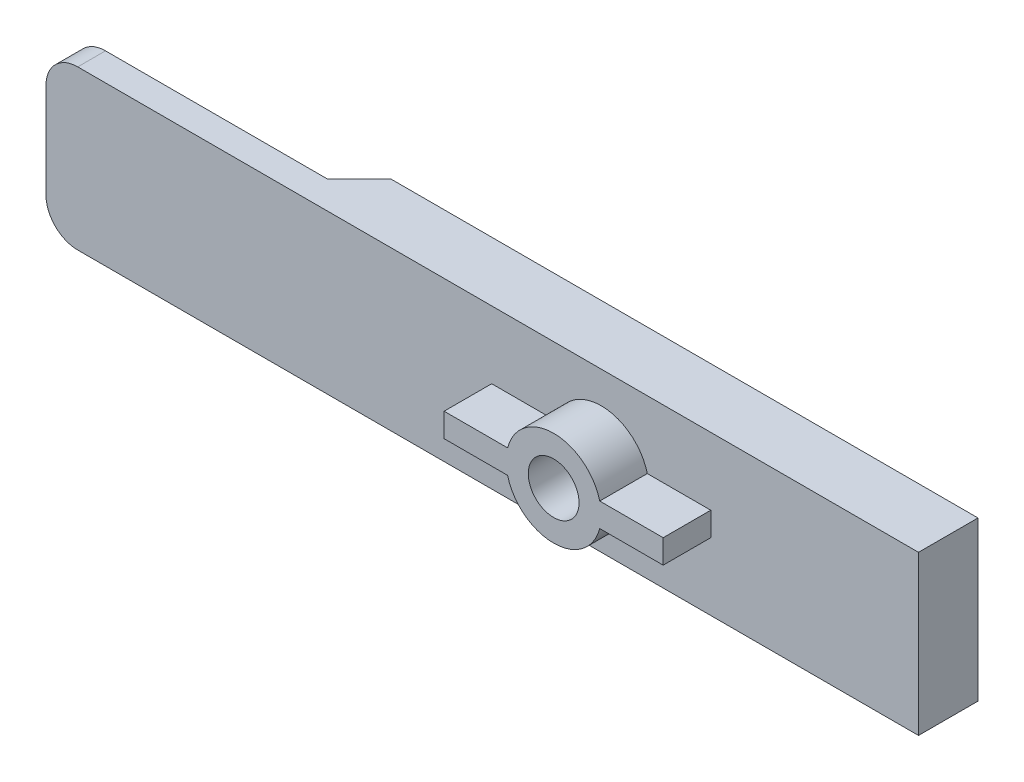
ISO-10303-21;
HEADER;
FILE_DESCRIPTION(('STEP AP214'),'2;1');
FILE_NAME('part.step','',(''),(''),'','','');
FILE_SCHEMA(('AUTOMOTIVE_DESIGN { 1 0 10303 214 1 1 1 1 }'));
ENDSEC;
DATA;
#1=APPLICATION_CONTEXT('core data for automotive mechanical design processes');
#2=APPLICATION_PROTOCOL_DEFINITION('international standard','automotive_design',2000,#1);
#3=PRODUCT_CONTEXT('',#1,'mechanical');
#4=PRODUCT('Part','Part','',(#3));
#5=PRODUCT_RELATED_PRODUCT_CATEGORY('part','',(#4));
#6=PRODUCT_DEFINITION_FORMATION('','',#4);
#7=PRODUCT_DEFINITION_CONTEXT('part definition',#1,'design');
#8=PRODUCT_DEFINITION('design','',#6,#7);
#9=PRODUCT_DEFINITION_SHAPE('','',#8);
#10=(LENGTH_UNIT() NAMED_UNIT(*) SI_UNIT(.MILLI.,.METRE.));
#11=(NAMED_UNIT(*) PLANE_ANGLE_UNIT() SI_UNIT($,.RADIAN.));
#12=(NAMED_UNIT(*) SI_UNIT($,.STERADIAN.) SOLID_ANGLE_UNIT());
#13=UNCERTAINTY_MEASURE_WITH_UNIT(LENGTH_MEASURE(1.E-05),#10,'distance_accuracy_value','');
#14=(GEOMETRIC_REPRESENTATION_CONTEXT(3) GLOBAL_UNCERTAINTY_ASSIGNED_CONTEXT((#13)) GLOBAL_UNIT_ASSIGNED_CONTEXT((#10,
#11,#12)) REPRESENTATION_CONTEXT('',''));
#15=CARTESIAN_POINT('',(0.,0.,0.));
#16=DIRECTION('',(0.,0.,1.));
#17=DIRECTION('',(1.,0.,0.));
#18=AXIS2_PLACEMENT_3D('',#15,#16,#17);
#19=CARTESIAN_POINT('',(-10.,0.,0.));
#20=DIRECTION('',(0.,0.,1.));
#21=DIRECTION('',(1.,0.,0.));
#22=AXIS2_PLACEMENT_3D('',#19,#20,#21);
#23=PLANE('',#22);
#24=DIRECTION('',(1.,0.,0.));
#25=VECTOR('',#24,1.);
#26=CARTESIAN_POINT('',(-15.,6.,0.));
#27=LINE('',#26,#25);
#28=CARTESIAN_POINT('',(-15.,6.,0.));
#29=VERTEX_POINT('',#28);
#30=CARTESIAN_POINT('',(1.00000000000003,6.,0.));
#31=VERTEX_POINT('',#30);
#32=EDGE_CURVE('E259',#29,#31,#27,.T.);
#33=ORIENTED_EDGE('',*,*,#32,.F.);
#34=DIRECTION('',(0.,-1.,0.));
#35=VECTOR('',#34,1.);
#36=CARTESIAN_POINT('',(-15.,10.,0.));
#37=LINE('',#36,#35);
#38=CARTESIAN_POINT('',(-15.,8.,0.));
#39=VERTEX_POINT('',#38);
#40=EDGE_CURVE('E256',#39,#29,#37,.T.);
#41=ORIENTED_EDGE('',*,*,#40,.F.);
#42=CARTESIAN_POINT('',(-13.,8.,0.));
#43=DIRECTION('',(0.,0.,1.));
#44=DIRECTION('',(1.,0.,0.));
#45=AXIS2_PLACEMENT_3D('',#42,#43,#44);
#46=CIRCLE('',#45,2.);
#47=CARTESIAN_POINT('',(-13.,10.,0.));
#48=VERTEX_POINT('',#47);
#49=EDGE_CURVE('E66',#39,#48,#46,.F.);
#50=ORIENTED_EDGE('',*,*,#49,.T.);
#51=DIRECTION('',(1.,0.,0.));
#52=VECTOR('',#51,1.);
#53=CARTESIAN_POINT('',(-9.99999999999999,10.,0.));
#54=LINE('',#53,#52);
#55=CARTESIAN_POINT('',(1.00000000000004,10.,0.));
#56=VERTEX_POINT('',#55);
#57=EDGE_CURVE('E239',#48,#56,#54,.T.);
#58=ORIENTED_EDGE('',*,*,#57,.T.);
#59=DIRECTION('',(0.,-1.,0.));
#60=VECTOR('',#59,1.);
#61=CARTESIAN_POINT('',(1.00000000000003,0.,0.));
#62=LINE('',#61,#60);
#63=EDGE_CURVE('E213',#56,#31,#62,.T.);
#64=ORIENTED_EDGE('',*,*,#63,.T.);
#65=EDGE_LOOP('',(#33,#41,#50,#58,#64));
#66=FACE_BOUND('',#65,.T.);
#67=ADVANCED_FACE('F43',(#66),#23,.F.);
#68=DIRECTION('',(-1.,0.,0.));
#69=VECTOR('',#68,1.);
#70=CARTESIAN_POINT('',(-15.,4.,0.));
#71=LINE('',#70,#69);
#72=CARTESIAN_POINT('',(1.00000000000003,4.,0.));
#73=VERTEX_POINT('',#72);
#74=CARTESIAN_POINT('',(-15.,4.,0.));
#75=VERTEX_POINT('',#74);
#76=EDGE_CURVE('E187',#73,#75,#71,.T.);
#77=ORIENTED_EDGE('',*,*,#76,.F.);
#78=CARTESIAN_POINT('',(1.00000000000003,0.,0.));
#79=VERTEX_POINT('',#78);
#80=EDGE_CURVE('E195',#73,#79,#62,.T.);
#81=ORIENTED_EDGE('',*,*,#80,.T.);
#82=DIRECTION('',(1.,0.,0.));
#83=VECTOR('',#82,1.);
#84=CARTESIAN_POINT('',(-10.,0.,0.));
#85=LINE('',#84,#83);
#86=CARTESIAN_POINT('',(-13.,0.,0.));
#87=VERTEX_POINT('',#86);
#88=EDGE_CURVE('E319',#87,#79,#85,.T.);
#89=ORIENTED_EDGE('',*,*,#88,.F.);
#90=CARTESIAN_POINT('',(-13.,2.,0.));
#91=DIRECTION('',(0.,0.,1.));
#92=DIRECTION('',(1.,0.,0.));
#93=AXIS2_PLACEMENT_3D('',#90,#91,#92);
#94=CIRCLE('',#93,2.);
#95=CARTESIAN_POINT('',(-15.,2.,0.));
#96=VERTEX_POINT('',#95);
#97=EDGE_CURVE('E229',#87,#96,#94,.F.);
#98=ORIENTED_EDGE('',*,*,#97,.T.);
#99=EDGE_CURVE('E260',#75,#96,#37,.T.);
#100=ORIENTED_EDGE('',*,*,#99,.F.);
#101=EDGE_LOOP('',(#77,#81,#89,#98,#100));
#102=FACE_BOUND('',#101,.T.);
#103=ADVANCED_FACE('F392',(#102),#23,.F.);
#104=CARTESIAN_POINT('',(3.00000000000005,0.,-2.));
#105=DIRECTION('',(-0.707106781186544,0.,-0.707106781186551));
#106=DIRECTION('',(0.,-1.,0.));
#107=AXIS2_PLACEMENT_3D('',#104,#105,#106);
#108=PLANE('',#107);
#109=DIRECTION('',(0.,1.,0.));
#110=VECTOR('',#109,1.);
#111=CARTESIAN_POINT('',(3.00000000000006,10.,-2.));
#112=LINE('',#111,#110);
#113=CARTESIAN_POINT('',(3.00000000000005,6.,-2.));
#114=VERTEX_POINT('',#113);
#115=CARTESIAN_POINT('',(3.00000000000006,10.,-2.));
#116=VERTEX_POINT('',#115);
#117=EDGE_CURVE('E203',#114,#116,#112,.T.);
#118=ORIENTED_EDGE('',*,*,#117,.F.);
#119=DIRECTION('',(-0.707106781186551,0.,0.707106781186544));
#120=VECTOR('',#119,1.);
#121=CARTESIAN_POINT('',(3.00000000000005,6.,-2.));
#122=LINE('',#121,#120);
#123=EDGE_CURVE('E12',#114,#31,#122,.T.);
#124=ORIENTED_EDGE('',*,*,#123,.T.);
#125=ORIENTED_EDGE('',*,*,#63,.F.);
#126=DIRECTION('',(-0.707106781186551,0.,0.707106781186544));
#127=VECTOR('',#126,1.);
#128=CARTESIAN_POINT('',(3.00000000000006,10.,-2.));
#129=LINE('',#128,#127);
#130=EDGE_CURVE('E202',#116,#56,#129,.T.);
#131=ORIENTED_EDGE('',*,*,#130,.F.);
#132=EDGE_LOOP('',(#118,#124,#125,#131));
#133=FACE_BOUND('',#132,.T.);
#134=ADVANCED_FACE('F397',(#133),#108,.T.);
#135=ORIENTED_EDGE('',*,*,#80,.F.);
#136=DIRECTION('',(0.707106781186551,0.,-0.707106781186544));
#137=VECTOR('',#136,1.);
#138=CARTESIAN_POINT('',(3.00000000000005,4.,-2.));
#139=LINE('',#138,#137);
#140=CARTESIAN_POINT('',(3.00000000000005,4.,-2.));
#141=VERTEX_POINT('',#140);
#142=EDGE_CURVE('E51',#73,#141,#139,.T.);
#143=ORIENTED_EDGE('',*,*,#142,.T.);
#144=CARTESIAN_POINT('',(3.00000000000005,0.,-2.));
#145=VERTEX_POINT('',#144);
#146=EDGE_CURVE('E194',#145,#141,#112,.T.);
#147=ORIENTED_EDGE('',*,*,#146,.F.);
#148=DIRECTION('',(0.707106781186551,0.,-0.707106781186544));
#149=VECTOR('',#148,1.);
#150=CARTESIAN_POINT('',(3.00000000000005,0.,-2.));
#151=LINE('',#150,#149);
#152=EDGE_CURVE('E206',#79,#145,#151,.T.);
#153=ORIENTED_EDGE('',*,*,#152,.F.);
#154=EDGE_LOOP('',(#135,#143,#147,#153));
#155=FACE_BOUND('',#154,.T.);
#156=ADVANCED_FACE('F192',(#155),#108,.T.);
#157=CARTESIAN_POINT('',(0.,0.,1.75));
#158=DIRECTION('',(0.,0.,-1.));
#159=DIRECTION('',(-1.,0.,0.));
#160=AXIS2_PLACEMENT_3D('',#157,#158,#159);
#161=PLANE('',#160);
#162=DIRECTION('',(0.,1.,0.));
#163=VECTOR('',#162,1.);
#164=CARTESIAN_POINT('',(-15.,0.,1.75));
#165=LINE('',#164,#163);
#166=CARTESIAN_POINT('',(-15.,2.,1.75));
#167=VERTEX_POINT('',#166);
#168=CARTESIAN_POINT('',(-15.,8.,1.75));
#169=VERTEX_POINT('',#168);
#170=EDGE_CURVE('E257',#167,#169,#165,.T.);
#171=ORIENTED_EDGE('',*,*,#170,.F.);
#172=CARTESIAN_POINT('',(-13.,2.,1.75));
#173=DIRECTION('',(0.,0.,-1.));
#174=DIRECTION('',(-1.,0.,0.));
#175=AXIS2_PLACEMENT_3D('',#172,#173,#174);
#176=CIRCLE('',#175,2.);
#177=CARTESIAN_POINT('',(-13.,0.,1.75));
#178=VERTEX_POINT('',#177);
#179=EDGE_CURVE('E224',#167,#178,#176,.F.);
#180=ORIENTED_EDGE('',*,*,#179,.T.);
#181=DIRECTION('',(1.,0.,0.));
#182=VECTOR('',#181,1.);
#183=CARTESIAN_POINT('',(0.,0.,1.75));
#184=LINE('',#183,#182);
#185=CARTESIAN_POINT('',(40.,0.,1.75));
#186=VERTEX_POINT('',#185);
#187=EDGE_CURVE('E334',#178,#186,#184,.T.);
#188=ORIENTED_EDGE('',*,*,#187,.T.);
#189=DIRECTION('',(0.,1.,0.));
#190=VECTOR('',#189,1.);
#191=CARTESIAN_POINT('',(40.,0.,1.75));
#192=LINE('',#191,#190);
#193=CARTESIAN_POINT('',(40.,10.,1.75));
#194=VERTEX_POINT('',#193);
#195=EDGE_CURVE('E248',#186,#194,#192,.T.);
#196=ORIENTED_EDGE('',*,*,#195,.T.);
#197=DIRECTION('',(-1.,0.,0.));
#198=VECTOR('',#197,1.);
#199=CARTESIAN_POINT('',(0.,10.,1.75));
#200=LINE('',#199,#198);
#201=CARTESIAN_POINT('',(-13.,10.,1.75));
#202=VERTEX_POINT('',#201);
#203=EDGE_CURVE('E238',#194,#202,#200,.T.);
#204=ORIENTED_EDGE('',*,*,#203,.T.);
#205=CARTESIAN_POINT('',(-13.,8.,1.75));
#206=DIRECTION('',(0.,0.,-1.));
#207=DIRECTION('',(-1.,0.,0.));
#208=AXIS2_PLACEMENT_3D('',#205,#206,#207);
#209=CIRCLE('',#208,2.);
#210=EDGE_CURVE('E222',#202,#169,#209,.F.);
#211=ORIENTED_EDGE('',*,*,#210,.T.);
#212=EDGE_LOOP('',(#171,#180,#188,#196,#204,#211));
#213=FACE_BOUND('',#212,.T.);
#214=DIRECTION('',(-1.,0.,0.));
#215=VECTOR('',#214,1.);
#216=CARTESIAN_POINT('',(22.9047375096556,5.75,1.75));
#217=LINE('',#216,#215);
#218=CARTESIAN_POINT('',(26.9047375096556,5.75,1.75));
#219=VERTEX_POINT('',#218);
#220=CARTESIAN_POINT('',(22.9047375096556,5.75,1.75));
#221=VERTEX_POINT('',#220);
#222=EDGE_CURVE('E271',#219,#221,#217,.T.);
#223=ORIENTED_EDGE('',*,*,#222,.F.);
#224=DIRECTION('',(0.,1.,0.));
#225=VECTOR('',#224,1.);
#226=CARTESIAN_POINT('',(26.9047375096556,5.75,1.75));
#227=LINE('',#226,#225);
#228=CARTESIAN_POINT('',(26.9047375096556,4.25,1.75));
#229=VERTEX_POINT('',#228);
#230=EDGE_CURVE('E275',#229,#219,#227,.T.);
#231=ORIENTED_EDGE('',*,*,#230,.F.);
#232=DIRECTION('',(1.,0.,0.));
#233=VECTOR('',#232,1.);
#234=CARTESIAN_POINT('',(22.9047375096556,4.25,1.75));
#235=LINE('',#234,#233);
#236=CARTESIAN_POINT('',(22.9047375096556,4.25,1.75));
#237=VERTEX_POINT('',#236);
#238=EDGE_CURVE('E274',#237,#229,#235,.T.);
#239=ORIENTED_EDGE('',*,*,#238,.F.);
#240=CARTESIAN_POINT('',(20.,5.,1.75));
#241=DIRECTION('',(0.,0.,-1.));
#242=DIRECTION('',(-1.,0.,0.));
#243=AXIS2_PLACEMENT_3D('',#240,#241,#242);
#244=CIRCLE('',#243,2.99999999999999);
#245=CARTESIAN_POINT('',(17.0952624903444,4.25,1.75));
#246=VERTEX_POINT('',#245);
#247=EDGE_CURVE('E208',#246,#237,#244,.F.);
#248=ORIENTED_EDGE('',*,*,#247,.F.);
#249=DIRECTION('',(1.,0.,0.));
#250=VECTOR('',#249,1.);
#251=CARTESIAN_POINT('',(17.0952624903444,4.25,1.75));
#252=LINE('',#251,#250);
#253=CARTESIAN_POINT('',(13.0952624903444,4.25,1.75));
#254=VERTEX_POINT('',#253);
#255=EDGE_CURVE('E293',#254,#246,#252,.T.);
#256=ORIENTED_EDGE('',*,*,#255,.F.);
#257=DIRECTION('',(0.,-1.,0.));
#258=VECTOR('',#257,1.);
#259=CARTESIAN_POINT('',(13.0952624903444,5.75,1.75));
#260=LINE('',#259,#258);
#261=CARTESIAN_POINT('',(13.0952624903444,5.75,1.75));
#262=VERTEX_POINT('',#261);
#263=EDGE_CURVE('E297',#262,#254,#260,.T.);
#264=ORIENTED_EDGE('',*,*,#263,.F.);
#265=DIRECTION('',(-1.,0.,0.));
#266=VECTOR('',#265,1.);
#267=CARTESIAN_POINT('',(17.0952624903444,5.75,1.75));
#268=LINE('',#267,#266);
#269=CARTESIAN_POINT('',(17.0952624903444,5.75,1.75));
#270=VERTEX_POINT('',#269);
#271=EDGE_CURVE('E301',#270,#262,#268,.T.);
#272=ORIENTED_EDGE('',*,*,#271,.F.);
#273=EDGE_CURVE('E338',#221,#270,#244,.F.);
#274=ORIENTED_EDGE('',*,*,#273,.F.);
#275=EDGE_LOOP('',(#223,#231,#239,#248,#256,#264,#272,#274));
#276=FACE_BOUND('',#275,.T.);
#277=ADVANCED_FACE('F244',(#213,#276),#161,.F.);
#278=CARTESIAN_POINT('',(20.,5.,4.75));
#279=DIRECTION('',(0.,0.,-1.));
#280=DIRECTION('',(-1.,0.,0.));
#281=AXIS2_PLACEMENT_3D('',#278,#279,#280);
#282=CYLINDRICAL_SURFACE('',#281,2.99999999999999);
#283=DIRECTION('',(0.,0.,-1.));
#284=VECTOR('',#283,1.);
#285=CARTESIAN_POINT('',(22.9047375096556,5.75,9.02200187265877));
#286=LINE('',#285,#284);
#287=CARTESIAN_POINT('',(22.9047375096556,5.74999999999999,4.75));
#288=VERTEX_POINT('',#287);
#289=EDGE_CURVE('E278',#288,#221,#286,.T.);
#290=ORIENTED_EDGE('',*,*,#289,.T.);
#291=ORIENTED_EDGE('',*,*,#273,.T.);
#292=DIRECTION('',(0.,0.,-1.));
#293=VECTOR('',#292,1.);
#294=CARTESIAN_POINT('',(17.0952624903444,5.75,9.02200187265877));
#295=LINE('',#294,#293);
#296=CARTESIAN_POINT('',(17.0952624903444,5.75,4.75));
#297=VERTEX_POINT('',#296);
#298=EDGE_CURVE('E304',#297,#270,#295,.T.);
#299=ORIENTED_EDGE('',*,*,#298,.F.);
#300=CARTESIAN_POINT('',(20.,5.,4.75));
#301=DIRECTION('',(0.,0.,1.));
#302=DIRECTION('',(1.,0.,0.));
#303=AXIS2_PLACEMENT_3D('',#300,#301,#302);
#304=CIRCLE('',#303,2.99999999999999);
#305=EDGE_CURVE('E325',#288,#297,#304,.T.);
#306=ORIENTED_EDGE('',*,*,#305,.F.);
#307=EDGE_LOOP('',(#290,#291,#299,#306));
#308=FACE_BOUND('',#307,.T.);
#309=ADVANCED_FACE('F374',(#308),#282,.T.);
#310=DIRECTION('',(0.,0.,-1.));
#311=VECTOR('',#310,1.);
#312=CARTESIAN_POINT('',(22.9047375096556,4.25,9.02200187265877));
#313=LINE('',#312,#311);
#314=CARTESIAN_POINT('',(22.9047375096556,4.25,4.75));
#315=VERTEX_POINT('',#314);
#316=EDGE_CURVE('E276',#315,#237,#313,.T.);
#317=ORIENTED_EDGE('',*,*,#316,.F.);
#318=CARTESIAN_POINT('',(17.0952624903444,4.25000000000001,4.75));
#319=VERTEX_POINT('',#318);
#320=EDGE_CURVE('E326',#319,#315,#304,.T.);
#321=ORIENTED_EDGE('',*,*,#320,.F.);
#322=DIRECTION('',(0.,0.,-1.));
#323=VECTOR('',#322,1.);
#324=CARTESIAN_POINT('',(17.0952624903444,4.25,9.02200187265877));
#325=LINE('',#324,#323);
#326=EDGE_CURVE('E270',#319,#246,#325,.T.);
#327=ORIENTED_EDGE('',*,*,#326,.T.);
#328=ORIENTED_EDGE('',*,*,#247,.T.);
#329=EDGE_LOOP('',(#317,#321,#327,#328));
#330=FACE_BOUND('',#329,.T.);
#331=ADVANCED_FACE('F349',(#330),#282,.T.);
#332=CARTESIAN_POINT('',(0.,0.,1.75));
#333=DIRECTION('',(0.,1.,0.));
#334=DIRECTION('',(0.,0.,1.));
#335=AXIS2_PLACEMENT_3D('',#332,#333,#334);
#336=PLANE('',#335);
#337=ORIENTED_EDGE('',*,*,#187,.F.);
#338=DIRECTION('',(0.,0.,1.));
#339=VECTOR('',#338,1.);
#340=CARTESIAN_POINT('',(-13.,0.,0.));
#341=LINE('',#340,#339);
#342=EDGE_CURVE('E226',#178,#87,#341,.F.);
#343=ORIENTED_EDGE('',*,*,#342,.T.);
#344=ORIENTED_EDGE('',*,*,#88,.T.);
#345=ORIENTED_EDGE('',*,*,#152,.T.);
#346=DIRECTION('',(-1.,0.,0.));
#347=VECTOR('',#346,1.);
#348=CARTESIAN_POINT('',(40.,0.,-2.));
#349=LINE('',#348,#347);
#350=CARTESIAN_POINT('',(40.,0.,-2.));
#351=VERTEX_POINT('',#350);
#352=EDGE_CURVE('E201',#351,#145,#349,.T.);
#353=ORIENTED_EDGE('',*,*,#352,.F.);
#354=DIRECTION('',(0.,0.,-1.));
#355=VECTOR('',#354,1.);
#356=CARTESIAN_POINT('',(40.,0.,1.75));
#357=LINE('',#356,#355);
#358=EDGE_CURVE('E337',#186,#351,#357,.T.);
#359=ORIENTED_EDGE('',*,*,#358,.F.);
#360=EDGE_LOOP('',(#337,#343,#344,#345,#353,#359));
#361=FACE_BOUND('',#360,.T.);
#362=ADVANCED_FACE('F419',(#361),#336,.F.);
#363=CARTESIAN_POINT('',(40.,0.,1.75));
#364=DIRECTION('',(-1.,0.,0.));
#365=DIRECTION('',(0.,-1.,0.));
#366=AXIS2_PLACEMENT_3D('',#363,#364,#365);
#367=PLANE('',#366);
#368=ORIENTED_EDGE('',*,*,#358,.T.);
#369=DIRECTION('',(0.,-1.,0.));
#370=VECTOR('',#369,1.);
#371=CARTESIAN_POINT('',(40.,10.,-2.));
#372=LINE('',#371,#370);
#373=CARTESIAN_POINT('',(40.,10.,-2.));
#374=VERTEX_POINT('',#373);
#375=EDGE_CURVE('E329',#374,#351,#372,.T.);
#376=ORIENTED_EDGE('',*,*,#375,.F.);
#377=DIRECTION('',(0.,0.,-1.));
#378=VECTOR('',#377,1.);
#379=CARTESIAN_POINT('',(40.,10.,1.75));
#380=LINE('',#379,#378);
#381=EDGE_CURVE('E250',#194,#374,#380,.T.);
#382=ORIENTED_EDGE('',*,*,#381,.F.);
#383=ORIENTED_EDGE('',*,*,#195,.F.);
#384=EDGE_LOOP('',(#368,#376,#382,#383));
#385=FACE_BOUND('',#384,.T.);
#386=ADVANCED_FACE('F416',(#385),#367,.F.);
#387=CARTESIAN_POINT('',(0.,10.,1.75));
#388=DIRECTION('',(0.,-1.,0.));
#389=DIRECTION('',(0.,0.,-1.));
#390=AXIS2_PLACEMENT_3D('',#387,#388,#389);
#391=PLANE('',#390);
#392=ORIENTED_EDGE('',*,*,#57,.F.);
#393=DIRECTION('',(0.,0.,-1.));
#394=VECTOR('',#393,1.);
#395=CARTESIAN_POINT('',(-13.,10.,1.75));
#396=LINE('',#395,#394);
#397=EDGE_CURVE('E196',#48,#202,#396,.F.);
#398=ORIENTED_EDGE('',*,*,#397,.T.);
#399=ORIENTED_EDGE('',*,*,#203,.F.);
#400=ORIENTED_EDGE('',*,*,#381,.T.);
#401=DIRECTION('',(1.,0.,0.));
#402=VECTOR('',#401,1.);
#403=CARTESIAN_POINT('',(40.,10.,-2.));
#404=LINE('',#403,#402);
#405=EDGE_CURVE('E332',#116,#374,#404,.T.);
#406=ORIENTED_EDGE('',*,*,#405,.F.);
#407=ORIENTED_EDGE('',*,*,#130,.T.);
#408=EDGE_LOOP('',(#392,#398,#399,#400,#406,#407));
#409=FACE_BOUND('',#408,.T.);
#410=ADVANCED_FACE('F236',(#409),#391,.F.);
#411=CARTESIAN_POINT('',(0.,0.,-2.));
#412=DIRECTION('',(0.,0.,-1.));
#413=DIRECTION('',(-1.,0.,0.));
#414=AXIS2_PLACEMENT_3D('',#411,#412,#413);
#415=PLANE('',#414);
#416=ORIENTED_EDGE('',*,*,#352,.T.);
#417=ORIENTED_EDGE('',*,*,#146,.T.);
#418=DIRECTION('',(-1.,0.,0.));
#419=VECTOR('',#418,1.);
#420=CARTESIAN_POINT('',(-15.,4.,-2.));
#421=LINE('',#420,#419);
#422=CARTESIAN_POINT('',(-15.,4.,-2.));
#423=VERTEX_POINT('',#422);
#424=EDGE_CURVE('E179',#141,#423,#421,.T.);
#425=ORIENTED_EDGE('',*,*,#424,.T.);
#426=DIRECTION('',(0.,1.,0.));
#427=VECTOR('',#426,1.);
#428=CARTESIAN_POINT('',(-15.,6.,-2.));
#429=LINE('',#428,#427);
#430=CARTESIAN_POINT('',(-15.,6.,-2.));
#431=VERTEX_POINT('',#430);
#432=EDGE_CURVE('E186',#423,#431,#429,.T.);
#433=ORIENTED_EDGE('',*,*,#432,.T.);
#434=DIRECTION('',(1.,0.,0.));
#435=VECTOR('',#434,1.);
#436=CARTESIAN_POINT('',(-15.,6.,-2.));
#437=LINE('',#436,#435);
#438=EDGE_CURVE('E445',#431,#114,#437,.T.);
#439=ORIENTED_EDGE('',*,*,#438,.T.);
#440=ORIENTED_EDGE('',*,*,#117,.T.);
#441=ORIENTED_EDGE('',*,*,#405,.T.);
#442=ORIENTED_EDGE('',*,*,#375,.T.);
#443=EDGE_LOOP('',(#416,#417,#425,#433,#439,#440,#441,#442));
#444=FACE_BOUND('',#443,.T.);
#445=ADVANCED_FACE('F198',(#444),#415,.T.);
#446=CARTESIAN_POINT('',(20.,5.,4.75));
#447=DIRECTION('',(0.,0.,1.));
#448=DIRECTION('',(1.,0.,0.));
#449=AXIS2_PLACEMENT_3D('',#446,#447,#448);
#450=PLANE('',#449);
#451=ORIENTED_EDGE('',*,*,#320,.T.);
#452=DIRECTION('',(1.,0.,0.));
#453=VECTOR('',#452,1.);
#454=CARTESIAN_POINT('',(22.9047375096556,4.25,4.75));
#455=LINE('',#454,#453);
#456=CARTESIAN_POINT('',(26.9047375096556,4.25,4.75));
#457=VERTEX_POINT('',#456);
#458=EDGE_CURVE('E262',#315,#457,#455,.T.);
#459=ORIENTED_EDGE('',*,*,#458,.T.);
#460=DIRECTION('',(0.,1.,0.));
#461=VECTOR('',#460,1.);
#462=CARTESIAN_POINT('',(26.9047375096556,5.75,4.75));
#463=LINE('',#462,#461);
#464=CARTESIAN_POINT('',(26.9047375096556,5.75,4.75));
#465=VERTEX_POINT('',#464);
#466=EDGE_CURVE('E281',#457,#465,#463,.T.);
#467=ORIENTED_EDGE('',*,*,#466,.T.);
#468=DIRECTION('',(-1.,0.,0.));
#469=VECTOR('',#468,1.);
#470=CARTESIAN_POINT('',(22.9047375096556,5.75,4.75));
#471=LINE('',#470,#469);
#472=EDGE_CURVE('E284',#465,#288,#471,.T.);
#473=ORIENTED_EDGE('',*,*,#472,.T.);
#474=ORIENTED_EDGE('',*,*,#305,.T.);
#475=DIRECTION('',(-1.,0.,0.));
#476=VECTOR('',#475,1.);
#477=CARTESIAN_POINT('',(17.0952624903444,5.75,4.75));
#478=LINE('',#477,#476);
#479=CARTESIAN_POINT('',(13.0952624903444,5.75,4.75));
#480=VERTEX_POINT('',#479);
#481=EDGE_CURVE('E308',#297,#480,#478,.T.);
#482=ORIENTED_EDGE('',*,*,#481,.T.);
#483=DIRECTION('',(0.,-1.,0.));
#484=VECTOR('',#483,1.);
#485=CARTESIAN_POINT('',(13.0952624903444,5.75,4.75));
#486=LINE('',#485,#484);
#487=CARTESIAN_POINT('',(13.0952624903444,4.25,4.75));
#488=VERTEX_POINT('',#487);
#489=EDGE_CURVE('E305',#480,#488,#486,.T.);
#490=ORIENTED_EDGE('',*,*,#489,.T.);
#491=DIRECTION('',(1.,0.,0.));
#492=VECTOR('',#491,1.);
#493=CARTESIAN_POINT('',(17.0952624903444,4.25,4.75));
#494=LINE('',#493,#492);
#495=EDGE_CURVE('E295',#488,#319,#494,.T.);
#496=ORIENTED_EDGE('',*,*,#495,.T.);
#497=EDGE_LOOP('',(#451,#459,#467,#473,#474,#482,#490,#496));
#498=FACE_BOUND('',#497,.T.);
#499=CARTESIAN_POINT('',(20.,5.,4.75));
#500=DIRECTION('',(0.,0.,1.));
#501=DIRECTION('',(1.,0.,0.));
#502=AXIS2_PLACEMENT_3D('',#499,#500,#501);
#503=CIRCLE('',#502,1.6);
#504=CARTESIAN_POINT('',(21.6,5.,4.75));
#505=VERTEX_POINT('',#504);
#506=EDGE_CURVE('E322',#505,#505,#503,.T.);
#507=ORIENTED_EDGE('',*,*,#506,.F.);
#508=EDGE_LOOP('',(#507));
#509=FACE_BOUND('',#508,.T.);
#510=ADVANCED_FACE('F361',(#498,#509),#450,.T.);
#511=CARTESIAN_POINT('',(20.,5.,4.75));
#512=DIRECTION('',(0.,0.,-1.));
#513=DIRECTION('',(-1.,0.,0.));
#514=AXIS2_PLACEMENT_3D('',#511,#512,#513);
#515=CYLINDRICAL_SURFACE('',#514,1.6);
#516=ORIENTED_EDGE('',*,*,#506,.T.);
#517=EDGE_LOOP('',(#516));
#518=FACE_BOUND('',#517,.T.);
#519=CARTESIAN_POINT('',(20.,5.,0.));
#520=DIRECTION('',(0.,0.,-1.));
#521=DIRECTION('',(-1.,0.,0.));
#522=AXIS2_PLACEMENT_3D('',#519,#520,#521);
#523=CIRCLE('',#522,1.6);
#524=CARTESIAN_POINT('',(18.4,5.,0.));
#525=VERTEX_POINT('',#524);
#526=EDGE_CURVE('E264',#525,#525,#523,.F.);
#527=ORIENTED_EDGE('',*,*,#526,.F.);
#528=EDGE_LOOP('',(#527));
#529=FACE_BOUND('',#528,.T.);
#530=ADVANCED_FACE('F402',(#518,#529),#515,.F.);
#531=CARTESIAN_POINT('',(17.0952624903444,5.75,9.02200187265877));
#532=DIRECTION('',(0.,-1.,0.));
#533=DIRECTION('',(0.,0.,-1.));
#534=AXIS2_PLACEMENT_3D('',#531,#532,#533);
#535=PLANE('',#534);
#536=ORIENTED_EDGE('',*,*,#481,.F.);
#537=ORIENTED_EDGE('',*,*,#298,.T.);
#538=ORIENTED_EDGE('',*,*,#271,.T.);
#539=DIRECTION('',(0.,0.,-1.));
#540=VECTOR('',#539,1.);
#541=CARTESIAN_POINT('',(13.0952624903444,5.75,9.02200187265877));
#542=LINE('',#541,#540);
#543=EDGE_CURVE('E300',#480,#262,#542,.T.);
#544=ORIENTED_EDGE('',*,*,#543,.F.);
#545=EDGE_LOOP('',(#536,#537,#538,#544));
#546=FACE_BOUND('',#545,.T.);
#547=ADVANCED_FACE('F372',(#546),#535,.F.);
#548=CARTESIAN_POINT('',(13.0952624903444,5.75,9.02200187265877));
#549=DIRECTION('',(1.,0.,0.));
#550=DIRECTION('',(0.,0.,-1.));
#551=AXIS2_PLACEMENT_3D('',#548,#549,#550);
#552=PLANE('',#551);
#553=ORIENTED_EDGE('',*,*,#489,.F.);
#554=ORIENTED_EDGE('',*,*,#543,.T.);
#555=ORIENTED_EDGE('',*,*,#263,.T.);
#556=DIRECTION('',(0.,0.,-1.));
#557=VECTOR('',#556,1.);
#558=CARTESIAN_POINT('',(13.0952624903444,4.25,9.02200187265877));
#559=LINE('',#558,#557);
#560=EDGE_CURVE('E296',#488,#254,#559,.T.);
#561=ORIENTED_EDGE('',*,*,#560,.F.);
#562=EDGE_LOOP('',(#553,#554,#555,#561));
#563=FACE_BOUND('',#562,.T.);
#564=ADVANCED_FACE('F367',(#563),#552,.F.);
#565=CARTESIAN_POINT('',(17.0952624903444,4.25,9.02200187265877));
#566=DIRECTION('',(0.,1.,0.));
#567=DIRECTION('',(-1.,0.,0.));
#568=AXIS2_PLACEMENT_3D('',#565,#566,#567);
#569=PLANE('',#568);
#570=ORIENTED_EDGE('',*,*,#495,.F.);
#571=ORIENTED_EDGE('',*,*,#560,.T.);
#572=ORIENTED_EDGE('',*,*,#255,.T.);
#573=ORIENTED_EDGE('',*,*,#326,.F.);
#574=EDGE_LOOP('',(#570,#571,#572,#573));
#575=FACE_BOUND('',#574,.T.);
#576=ADVANCED_FACE('F365',(#575),#569,.F.);
#577=CARTESIAN_POINT('',(22.9047375096556,5.75,9.02200187265877));
#578=DIRECTION('',(0.,-1.,0.));
#579=DIRECTION('',(1.,0.,0.));
#580=AXIS2_PLACEMENT_3D('',#577,#578,#579);
#581=PLANE('',#580);
#582=ORIENTED_EDGE('',*,*,#472,.F.);
#583=DIRECTION('',(0.,0.,-1.));
#584=VECTOR('',#583,1.);
#585=CARTESIAN_POINT('',(26.9047375096556,5.75,9.02200187265877));
#586=LINE('',#585,#584);
#587=EDGE_CURVE('E268',#465,#219,#586,.T.);
#588=ORIENTED_EDGE('',*,*,#587,.T.);
#589=ORIENTED_EDGE('',*,*,#222,.T.);
#590=ORIENTED_EDGE('',*,*,#289,.F.);
#591=EDGE_LOOP('',(#582,#588,#589,#590));
#592=FACE_BOUND('',#591,.T.);
#593=ADVANCED_FACE('F378',(#592),#581,.F.);
#594=CARTESIAN_POINT('',(22.9047375096556,4.25,9.02200187265877));
#595=DIRECTION('',(0.,1.,0.));
#596=DIRECTION('',(-1.,0.,0.));
#597=AXIS2_PLACEMENT_3D('',#594,#595,#596);
#598=PLANE('',#597);
#599=ORIENTED_EDGE('',*,*,#458,.F.);
#600=ORIENTED_EDGE('',*,*,#316,.T.);
#601=ORIENTED_EDGE('',*,*,#238,.T.);
#602=DIRECTION('',(0.,0.,-1.));
#603=VECTOR('',#602,1.);
#604=CARTESIAN_POINT('',(26.9047375096556,4.25,9.02200187265877));
#605=LINE('',#604,#603);
#606=EDGE_CURVE('E272',#457,#229,#605,.T.);
#607=ORIENTED_EDGE('',*,*,#606,.F.);
#608=EDGE_LOOP('',(#599,#600,#601,#607));
#609=FACE_BOUND('',#608,.T.);
#610=ADVANCED_FACE('F358',(#609),#598,.F.);
#611=CARTESIAN_POINT('',(26.9047375096556,5.75,9.02200187265877));
#612=DIRECTION('',(-1.,0.,0.));
#613=DIRECTION('',(0.,-1.,0.));
#614=AXIS2_PLACEMENT_3D('',#611,#612,#613);
#615=PLANE('',#614);
#616=ORIENTED_EDGE('',*,*,#466,.F.);
#617=ORIENTED_EDGE('',*,*,#606,.T.);
#618=ORIENTED_EDGE('',*,*,#230,.T.);
#619=ORIENTED_EDGE('',*,*,#587,.F.);
#620=EDGE_LOOP('',(#616,#617,#618,#619));
#621=FACE_BOUND('',#620,.T.);
#622=ADVANCED_FACE('F380',(#621),#615,.F.);
#623=CARTESIAN_POINT('',(-15.,0.,0.));
#624=DIRECTION('',(-1.,0.,0.));
#625=DIRECTION('',(0.,-1.,0.));
#626=AXIS2_PLACEMENT_3D('',#623,#624,#625);
#627=PLANE('',#626);
#628=ORIENTED_EDGE('',*,*,#40,.T.);
#629=DIRECTION('',(0.,0.,1.));
#630=VECTOR('',#629,1.);
#631=CARTESIAN_POINT('',(-15.,6.,-20.1107702762749));
#632=LINE('',#631,#630);
#633=EDGE_CURVE('E448',#431,#29,#632,.T.);
#634=ORIENTED_EDGE('',*,*,#633,.F.);
#635=ORIENTED_EDGE('',*,*,#432,.F.);
#636=DIRECTION('',(0.,0.,1.));
#637=VECTOR('',#636,1.);
#638=CARTESIAN_POINT('',(-15.,4.,-20.1107702762749));
#639=LINE('',#638,#637);
#640=EDGE_CURVE('E58',#423,#75,#639,.T.);
#641=ORIENTED_EDGE('',*,*,#640,.T.);
#642=ORIENTED_EDGE('',*,*,#99,.T.);
#643=DIRECTION('',(0.,0.,1.));
#644=VECTOR('',#643,1.);
#645=CARTESIAN_POINT('',(-15.,2.,1.75));
#646=LINE('',#645,#644);
#647=EDGE_CURVE('E219',#96,#167,#646,.T.);
#648=ORIENTED_EDGE('',*,*,#647,.T.);
#649=ORIENTED_EDGE('',*,*,#170,.T.);
#650=DIRECTION('',(0.,0.,-1.));
#651=VECTOR('',#650,1.);
#652=CARTESIAN_POINT('',(-15.,8.,0.));
#653=LINE('',#652,#651);
#654=EDGE_CURVE('E216',#169,#39,#653,.T.);
#655=ORIENTED_EDGE('',*,*,#654,.T.);
#656=EDGE_LOOP('',(#628,#634,#635,#641,#642,#648,#649,#655));
#657=FACE_BOUND('',#656,.T.);
#658=ADVANCED_FACE('F254',(#657),#627,.T.);
#659=CARTESIAN_POINT('',(-13.,2.,0.));
#660=DIRECTION('',(0.,0.,-1.));
#661=DIRECTION('',(-1.,0.,0.));
#662=AXIS2_PLACEMENT_3D('',#659,#660,#661);
#663=CYLINDRICAL_SURFACE('',#662,2.);
#664=ORIENTED_EDGE('',*,*,#97,.F.);
#665=ORIENTED_EDGE('',*,*,#342,.F.);
#666=ORIENTED_EDGE('',*,*,#179,.F.);
#667=ORIENTED_EDGE('',*,*,#647,.F.);
#668=EDGE_LOOP('',(#664,#665,#666,#667));
#669=FACE_BOUND('',#668,.T.);
#670=ADVANCED_FACE('F387',(#669),#663,.T.);
#671=CARTESIAN_POINT('',(-13.,8.,0.));
#672=DIRECTION('',(0.,0.,1.));
#673=DIRECTION('',(1.,0.,0.));
#674=AXIS2_PLACEMENT_3D('',#671,#672,#673);
#675=CYLINDRICAL_SURFACE('',#674,2.);
#676=ORIENTED_EDGE('',*,*,#210,.F.);
#677=ORIENTED_EDGE('',*,*,#397,.F.);
#678=ORIENTED_EDGE('',*,*,#49,.F.);
#679=ORIENTED_EDGE('',*,*,#654,.F.);
#680=EDGE_LOOP('',(#676,#677,#678,#679));
#681=FACE_BOUND('',#680,.T.);
#682=ADVANCED_FACE('F45',(#681),#675,.T.);
#683=CARTESIAN_POINT('',(0.,0.,0.));
#684=DIRECTION('',(0.,0.,-1.));
#685=DIRECTION('',(-1.,0.,0.));
#686=AXIS2_PLACEMENT_3D('',#683,#684,#685);
#687=PLANE('',#686);
#688=ORIENTED_EDGE('',*,*,#526,.T.);
#689=EDGE_LOOP('',(#688));
#690=FACE_BOUND('',#689,.T.);
#691=ADVANCED_FACE('F433',(#690),#687,.F.);
#692=CARTESIAN_POINT('',(-15.,6.,-20.1107702762749));
#693=DIRECTION('',(0.,-1.,0.));
#694=DIRECTION('',(1.,0.,0.));
#695=AXIS2_PLACEMENT_3D('',#692,#693,#694);
#696=PLANE('',#695);
#697=ORIENTED_EDGE('',*,*,#123,.F.);
#698=ORIENTED_EDGE('',*,*,#438,.F.);
#699=ORIENTED_EDGE('',*,*,#633,.T.);
#700=ORIENTED_EDGE('',*,*,#32,.T.);
#701=EDGE_LOOP('',(#697,#698,#699,#700));
#702=FACE_BOUND('',#701,.T.);
#703=ADVANCED_FACE('F447',(#702),#696,.F.);
#704=CARTESIAN_POINT('',(-15.,4.,-20.1107702762749));
#705=DIRECTION('',(0.,1.,0.));
#706=DIRECTION('',(-1.,0.,0.));
#707=AXIS2_PLACEMENT_3D('',#704,#705,#706);
#708=PLANE('',#707);
#709=ORIENTED_EDGE('',*,*,#142,.F.);
#710=ORIENTED_EDGE('',*,*,#76,.T.);
#711=ORIENTED_EDGE('',*,*,#640,.F.);
#712=ORIENTED_EDGE('',*,*,#424,.F.);
#713=EDGE_LOOP('',(#709,#710,#711,#712));
#714=FACE_BOUND('',#713,.T.);
#715=ADVANCED_FACE('F181',(#714),#708,.F.);
#716=CLOSED_SHELL('',(#67,#103,#134,#156,#277,#309,#331,#362,#386,#410,#445,#510,#530,#547,#564,
#576,#593,#610,#622,#658,#670,#682,#691,#703,#715));
#717=MANIFOLD_SOLID_BREP('B2',#716);
#718=ADVANCED_BREP_SHAPE_REPRESENTATION('',(#18,#717),#14);
#719=SHAPE_DEFINITION_REPRESENTATION(#9,#718);
ENDSEC;
END-ISO-10303-21;
